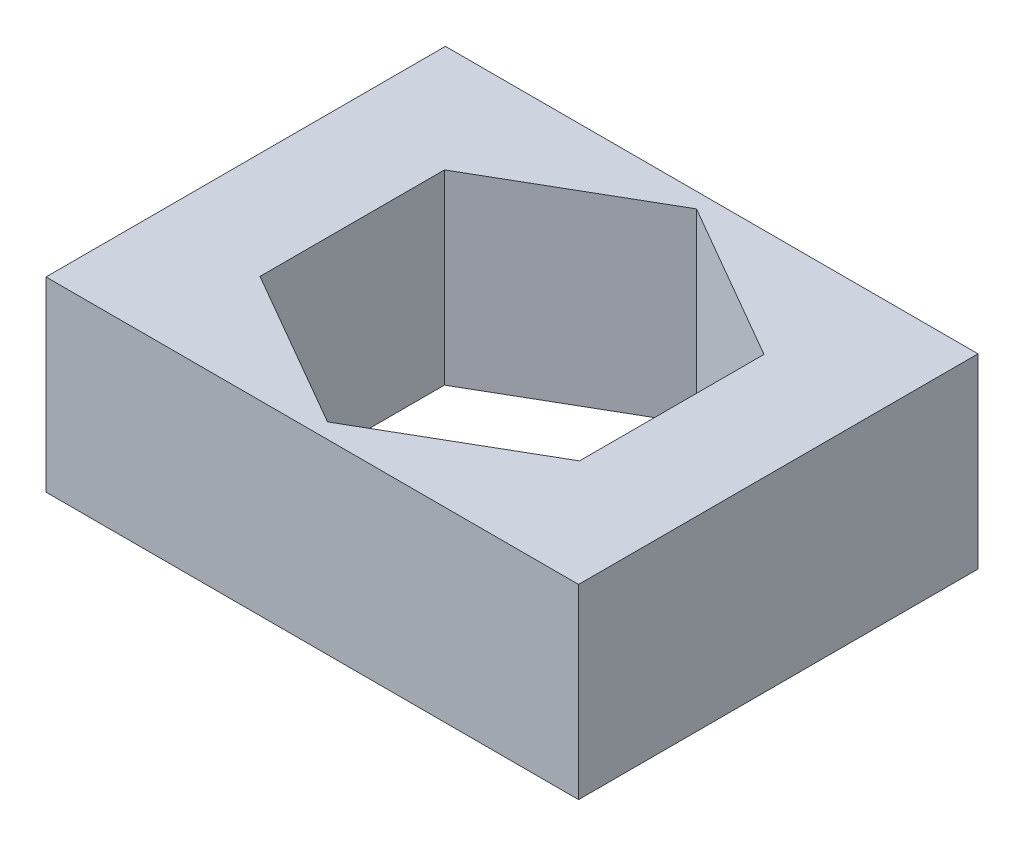
ISO-10303-21;
HEADER;
FILE_DESCRIPTION(('STEP AP214'),'2;1');
FILE_NAME('part.step','',(''),(''),'','','');
FILE_SCHEMA(('AUTOMOTIVE_DESIGN { 1 0 10303 214 1 1 1 1 }'));
ENDSEC;
DATA;
#1=APPLICATION_CONTEXT('core data for automotive mechanical design processes');
#2=APPLICATION_PROTOCOL_DEFINITION('international standard','automotive_design',2000,#1);
#3=PRODUCT_CONTEXT('',#1,'mechanical');
#4=PRODUCT('Part','Part','',(#3));
#5=PRODUCT_RELATED_PRODUCT_CATEGORY('part','',(#4));
#6=PRODUCT_DEFINITION_FORMATION('','',#4);
#7=PRODUCT_DEFINITION_CONTEXT('part definition',#1,'design');
#8=PRODUCT_DEFINITION('design','',#6,#7);
#9=PRODUCT_DEFINITION_SHAPE('','',#8);
#10=(LENGTH_UNIT() NAMED_UNIT(*) SI_UNIT(.MILLI.,.METRE.));
#11=(NAMED_UNIT(*) PLANE_ANGLE_UNIT() SI_UNIT($,.RADIAN.));
#12=(NAMED_UNIT(*) SI_UNIT($,.STERADIAN.) SOLID_ANGLE_UNIT());
#13=UNCERTAINTY_MEASURE_WITH_UNIT(LENGTH_MEASURE(1.E-05),#10,'distance_accuracy_value','');
#14=(GEOMETRIC_REPRESENTATION_CONTEXT(3) GLOBAL_UNCERTAINTY_ASSIGNED_CONTEXT((#13)) GLOBAL_UNIT_ASSIGNED_CONTEXT((#10,
#11,#12)) REPRESENTATION_CONTEXT('',''));
#15=CARTESIAN_POINT('',(0.,0.,0.));
#16=DIRECTION('',(0.,0.,1.));
#17=DIRECTION('',(1.,0.,0.));
#18=AXIS2_PLACEMENT_3D('',#15,#16,#17);
#19=CARTESIAN_POINT('',(10.,7.,7.5));
#20=DIRECTION('',(-1.,0.,0.));
#21=DIRECTION('',(0.,0.,1.));
#22=AXIS2_PLACEMENT_3D('',#19,#20,#21);
#23=PLANE('',#22);
#24=DIRECTION('',(0.,0.,-1.));
#25=VECTOR('',#24,1.);
#26=CARTESIAN_POINT('',(10.,0.,7.5));
#27=LINE('',#26,#25);
#28=CARTESIAN_POINT('',(10.,0.,7.5));
#29=VERTEX_POINT('',#28);
#30=CARTESIAN_POINT('',(10.,0.,-7.5));
#31=VERTEX_POINT('',#30);
#32=EDGE_CURVE('E175',#29,#31,#27,.T.);
#33=ORIENTED_EDGE('',*,*,#32,.T.);
#34=DIRECTION('',(0.,-1.,0.));
#35=VECTOR('',#34,1.);
#36=CARTESIAN_POINT('',(10.,7.,-7.5));
#37=LINE('',#36,#35);
#38=CARTESIAN_POINT('',(10.,7.,-7.5));
#39=VERTEX_POINT('',#38);
#40=EDGE_CURVE('E11',#39,#31,#37,.T.);
#41=ORIENTED_EDGE('',*,*,#40,.F.);
#42=DIRECTION('',(0.,0.,-1.));
#43=VECTOR('',#42,1.);
#44=CARTESIAN_POINT('',(10.,7.,7.5));
#45=LINE('',#44,#43);
#46=CARTESIAN_POINT('',(10.,7.,7.5));
#47=VERTEX_POINT('',#46);
#48=EDGE_CURVE('E187',#47,#39,#45,.T.);
#49=ORIENTED_EDGE('',*,*,#48,.F.);
#50=DIRECTION('',(0.,-1.,0.));
#51=VECTOR('',#50,1.);
#52=CARTESIAN_POINT('',(10.,7.,7.5));
#53=LINE('',#52,#51);
#54=EDGE_CURVE('E201',#47,#29,#53,.T.);
#55=ORIENTED_EDGE('',*,*,#54,.T.);
#56=EDGE_LOOP('',(#33,#41,#49,#55));
#57=FACE_BOUND('',#56,.T.);
#58=ADVANCED_FACE('F39',(#57),#23,.F.);
#59=CARTESIAN_POINT('',(-10.,7.,-7.5));
#60=DIRECTION('',(0.,0.,1.));
#61=DIRECTION('',(1.,0.,0.));
#62=AXIS2_PLACEMENT_3D('',#59,#60,#61);
#63=PLANE('',#62);
#64=DIRECTION('',(-1.,0.,0.));
#65=VECTOR('',#64,1.);
#66=CARTESIAN_POINT('',(-10.,0.,-7.5));
#67=LINE('',#66,#65);
#68=CARTESIAN_POINT('',(-10.,0.,-7.5));
#69=VERTEX_POINT('',#68);
#70=EDGE_CURVE('E205',#31,#69,#67,.T.);
#71=ORIENTED_EDGE('',*,*,#70,.T.);
#72=DIRECTION('',(0.,-1.,0.));
#73=VECTOR('',#72,1.);
#74=CARTESIAN_POINT('',(-10.,7.,-7.5));
#75=LINE('',#74,#73);
#76=CARTESIAN_POINT('',(-10.,7.,-7.5));
#77=VERTEX_POINT('',#76);
#78=EDGE_CURVE('E47',#77,#69,#75,.T.);
#79=ORIENTED_EDGE('',*,*,#78,.F.);
#80=DIRECTION('',(-1.,0.,0.));
#81=VECTOR('',#80,1.);
#82=CARTESIAN_POINT('',(-10.,7.,-7.5));
#83=LINE('',#82,#81);
#84=EDGE_CURVE('E191',#39,#77,#83,.T.);
#85=ORIENTED_EDGE('',*,*,#84,.F.);
#86=ORIENTED_EDGE('',*,*,#40,.T.);
#87=EDGE_LOOP('',(#71,#79,#85,#86));
#88=FACE_BOUND('',#87,.T.);
#89=ADVANCED_FACE('F239',(#88),#63,.F.);
#90=CARTESIAN_POINT('',(-10.,7.,7.5));
#91=DIRECTION('',(1.,0.,0.));
#92=DIRECTION('',(0.,0.,-1.));
#93=AXIS2_PLACEMENT_3D('',#90,#91,#92);
#94=PLANE('',#93);
#95=DIRECTION('',(0.,0.,1.));
#96=VECTOR('',#95,1.);
#97=CARTESIAN_POINT('',(-10.,0.,7.5));
#98=LINE('',#97,#96);
#99=CARTESIAN_POINT('',(-10.,0.,7.5));
#100=VERTEX_POINT('',#99);
#101=EDGE_CURVE('E208',#69,#100,#98,.T.);
#102=ORIENTED_EDGE('',*,*,#101,.T.);
#103=DIRECTION('',(0.,-1.,0.));
#104=VECTOR('',#103,1.);
#105=CARTESIAN_POINT('',(-10.,7.,7.5));
#106=LINE('',#105,#104);
#107=CARTESIAN_POINT('',(-10.,7.,7.5));
#108=VERTEX_POINT('',#107);
#109=EDGE_CURVE('E216',#108,#100,#106,.T.);
#110=ORIENTED_EDGE('',*,*,#109,.F.);
#111=DIRECTION('',(0.,0.,1.));
#112=VECTOR('',#111,1.);
#113=CARTESIAN_POINT('',(-10.,7.,7.5));
#114=LINE('',#113,#112);
#115=EDGE_CURVE('E195',#77,#108,#114,.T.);
#116=ORIENTED_EDGE('',*,*,#115,.F.);
#117=ORIENTED_EDGE('',*,*,#78,.T.);
#118=EDGE_LOOP('',(#102,#110,#116,#117));
#119=FACE_BOUND('',#118,.T.);
#120=ADVANCED_FACE('F225',(#119),#94,.F.);
#121=CARTESIAN_POINT('',(-10.,7.,7.5));
#122=DIRECTION('',(0.,0.,-1.));
#123=DIRECTION('',(-1.,0.,0.));
#124=AXIS2_PLACEMENT_3D('',#121,#122,#123);
#125=PLANE('',#124);
#126=DIRECTION('',(1.,0.,0.));
#127=VECTOR('',#126,1.);
#128=CARTESIAN_POINT('',(-10.,0.,7.5));
#129=LINE('',#128,#127);
#130=EDGE_CURVE('E192',#100,#29,#129,.T.);
#131=ORIENTED_EDGE('',*,*,#130,.T.);
#132=ORIENTED_EDGE('',*,*,#54,.F.);
#133=DIRECTION('',(1.,0.,0.));
#134=VECTOR('',#133,1.);
#135=CARTESIAN_POINT('',(-10.,7.,7.5));
#136=LINE('',#135,#134);
#137=EDGE_CURVE('E198',#108,#47,#136,.T.);
#138=ORIENTED_EDGE('',*,*,#137,.F.);
#139=ORIENTED_EDGE('',*,*,#109,.T.);
#140=EDGE_LOOP('',(#131,#132,#138,#139));
#141=FACE_BOUND('',#140,.T.);
#142=ADVANCED_FACE('F234',(#141),#125,.F.);
#143=CARTESIAN_POINT('',(0.,7.,0.));
#144=DIRECTION('',(0.,-1.,0.));
#145=DIRECTION('',(0.,0.,-1.));
#146=AXIS2_PLACEMENT_3D('',#143,#144,#145);
#147=PLANE('',#146);
#148=DIRECTION('',(0.,0.,1.));
#149=VECTOR('',#148,1.);
#150=CARTESIAN_POINT('',(6.,7.,-3.46410161513776));
#151=LINE('',#150,#149);
#152=CARTESIAN_POINT('',(6.,7.,-3.46410161513776));
#153=VERTEX_POINT('',#152);
#154=CARTESIAN_POINT('',(6.,7.,3.46410161513776));
#155=VERTEX_POINT('',#154);
#156=EDGE_CURVE('E125',#153,#155,#151,.T.);
#157=ORIENTED_EDGE('',*,*,#156,.T.);
#158=DIRECTION('',(-0.866025403784439,0.,0.5));
#159=VECTOR('',#158,1.);
#160=CARTESIAN_POINT('',(6.,7.,3.46410161513776));
#161=LINE('',#160,#159);
#162=CARTESIAN_POINT('',(0.,7.,6.92820323027551));
#163=VERTEX_POINT('',#162);
#164=EDGE_CURVE('E118',#155,#163,#161,.T.);
#165=ORIENTED_EDGE('',*,*,#164,.T.);
#166=DIRECTION('',(-0.866025403784439,0.,-0.5));
#167=VECTOR('',#166,1.);
#168=CARTESIAN_POINT('',(0.,7.,6.92820323027551));
#169=LINE('',#168,#167);
#170=CARTESIAN_POINT('',(-6.,7.,3.46410161513776));
#171=VERTEX_POINT('',#170);
#172=EDGE_CURVE('E128',#163,#171,#169,.T.);
#173=ORIENTED_EDGE('',*,*,#172,.T.);
#174=DIRECTION('',(0.,0.,-1.));
#175=VECTOR('',#174,1.);
#176=CARTESIAN_POINT('',(-6.,7.,3.46410161513776));
#177=LINE('',#176,#175);
#178=CARTESIAN_POINT('',(-6.,7.,-3.46410161513776));
#179=VERTEX_POINT('',#178);
#180=EDGE_CURVE('E54',#171,#179,#177,.T.);
#181=ORIENTED_EDGE('',*,*,#180,.T.);
#182=DIRECTION('',(0.866025403784439,0.,-0.5));
#183=VECTOR('',#182,1.);
#184=CARTESIAN_POINT('',(-6.,7.,-3.46410161513776));
#185=LINE('',#184,#183);
#186=CARTESIAN_POINT('',(0.,7.,-6.92820323027551));
#187=VERTEX_POINT('',#186);
#188=EDGE_CURVE('E147',#179,#187,#185,.T.);
#189=ORIENTED_EDGE('',*,*,#188,.T.);
#190=DIRECTION('',(0.866025403784439,0.,0.5));
#191=VECTOR('',#190,1.);
#192=CARTESIAN_POINT('',(0.,7.,-6.92820323027551));
#193=LINE('',#192,#191);
#194=EDGE_CURVE('E151',#187,#153,#193,.T.);
#195=ORIENTED_EDGE('',*,*,#194,.T.);
#196=EDGE_LOOP('',(#157,#165,#173,#181,#189,#195));
#197=FACE_BOUND('',#196,.T.);
#198=ORIENTED_EDGE('',*,*,#48,.T.);
#199=ORIENTED_EDGE('',*,*,#84,.T.);
#200=ORIENTED_EDGE('',*,*,#115,.T.);
#201=ORIENTED_EDGE('',*,*,#137,.T.);
#202=EDGE_LOOP('',(#198,#199,#200,#201));
#203=FACE_BOUND('',#202,.T.);
#204=ADVANCED_FACE('F133',(#197,#203),#147,.F.);
#205=CARTESIAN_POINT('',(0.,0.,0.));
#206=DIRECTION('',(0.,-1.,0.));
#207=DIRECTION('',(0.,0.,-1.));
#208=AXIS2_PLACEMENT_3D('',#205,#206,#207);
#209=PLANE('',#208);
#210=DIRECTION('',(-0.866025403784439,0.,0.5));
#211=VECTOR('',#210,1.);
#212=CARTESIAN_POINT('',(6.,0.,3.46410161513776));
#213=LINE('',#212,#211);
#214=CARTESIAN_POINT('',(6.,0.,3.46410161513776));
#215=VERTEX_POINT('',#214);
#216=CARTESIAN_POINT('',(0.,0.,6.92820323027551));
#217=VERTEX_POINT('',#216);
#218=EDGE_CURVE('E62',#215,#217,#213,.T.);
#219=ORIENTED_EDGE('',*,*,#218,.F.);
#220=DIRECTION('',(0.,0.,1.));
#221=VECTOR('',#220,1.);
#222=CARTESIAN_POINT('',(6.,0.,-3.46410161513776));
#223=LINE('',#222,#221);
#224=CARTESIAN_POINT('',(6.,0.,-3.46410161513776));
#225=VERTEX_POINT('',#224);
#226=EDGE_CURVE('E138',#225,#215,#223,.T.);
#227=ORIENTED_EDGE('',*,*,#226,.F.);
#228=DIRECTION('',(0.866025403784439,0.,0.5));
#229=VECTOR('',#228,1.);
#230=CARTESIAN_POINT('',(0.,0.,-6.92820323027551));
#231=LINE('',#230,#229);
#232=CARTESIAN_POINT('',(0.,0.,-6.92820323027551));
#233=VERTEX_POINT('',#232);
#234=EDGE_CURVE('E142',#233,#225,#231,.T.);
#235=ORIENTED_EDGE('',*,*,#234,.F.);
#236=DIRECTION('',(0.866025403784439,0.,-0.5));
#237=VECTOR('',#236,1.);
#238=CARTESIAN_POINT('',(-6.,0.,-3.46410161513776));
#239=LINE('',#238,#237);
#240=CARTESIAN_POINT('',(-6.,0.,-3.46410161513776));
#241=VERTEX_POINT('',#240);
#242=EDGE_CURVE('E165',#241,#233,#239,.T.);
#243=ORIENTED_EDGE('',*,*,#242,.F.);
#244=DIRECTION('',(0.,0.,-1.));
#245=VECTOR('',#244,1.);
#246=CARTESIAN_POINT('',(-6.,0.,3.46410161513776));
#247=LINE('',#246,#245);
#248=CARTESIAN_POINT('',(-6.,0.,3.46410161513776));
#249=VERTEX_POINT('',#248);
#250=EDGE_CURVE('E161',#249,#241,#247,.T.);
#251=ORIENTED_EDGE('',*,*,#250,.F.);
#252=DIRECTION('',(-0.866025403784439,0.,-0.5));
#253=VECTOR('',#252,1.);
#254=CARTESIAN_POINT('',(0.,0.,6.92820323027551));
#255=LINE('',#254,#253);
#256=EDGE_CURVE('E158',#217,#249,#255,.T.);
#257=ORIENTED_EDGE('',*,*,#256,.F.);
#258=EDGE_LOOP('',(#219,#227,#235,#243,#251,#257));
#259=FACE_BOUND('',#258,.T.);
#260=ORIENTED_EDGE('',*,*,#32,.F.);
#261=ORIENTED_EDGE('',*,*,#130,.F.);
#262=ORIENTED_EDGE('',*,*,#101,.F.);
#263=ORIENTED_EDGE('',*,*,#70,.F.);
#264=EDGE_LOOP('',(#260,#261,#262,#263));
#265=FACE_BOUND('',#264,.T.);
#266=ADVANCED_FACE('F231',(#259,#265),#209,.T.);
#267=CARTESIAN_POINT('',(6.,7.,3.46410161513776));
#268=DIRECTION('',(0.5,0.,0.866025403784439));
#269=DIRECTION('',(0.866025403784439,0.,-0.5));
#270=AXIS2_PLACEMENT_3D('',#267,#268,#269);
#271=PLANE('',#270);
#272=ORIENTED_EDGE('',*,*,#218,.T.);
#273=DIRECTION('',(0.,-1.,0.));
#274=VECTOR('',#273,1.);
#275=CARTESIAN_POINT('',(0.,7.,6.92820323027551));
#276=LINE('',#275,#274);
#277=EDGE_CURVE('E114',#163,#217,#276,.T.);
#278=ORIENTED_EDGE('',*,*,#277,.F.);
#279=ORIENTED_EDGE('',*,*,#164,.F.);
#280=DIRECTION('',(0.,-1.,0.));
#281=VECTOR('',#280,1.);
#282=CARTESIAN_POINT('',(6.,7.,3.46410161513776));
#283=LINE('',#282,#281);
#284=EDGE_CURVE('E172',#155,#215,#283,.T.);
#285=ORIENTED_EDGE('',*,*,#284,.T.);
#286=EDGE_LOOP('',(#272,#278,#279,#285));
#287=FACE_BOUND('',#286,.T.);
#288=ADVANCED_FACE('F116',(#287),#271,.F.);
#289=CARTESIAN_POINT('',(6.,7.,-3.46410161513776));
#290=DIRECTION('',(1.,0.,0.));
#291=DIRECTION('',(0.,0.,-1.));
#292=AXIS2_PLACEMENT_3D('',#289,#290,#291);
#293=PLANE('',#292);
#294=ORIENTED_EDGE('',*,*,#226,.T.);
#295=ORIENTED_EDGE('',*,*,#284,.F.);
#296=ORIENTED_EDGE('',*,*,#156,.F.);
#297=DIRECTION('',(0.,-1.,0.));
#298=VECTOR('',#297,1.);
#299=CARTESIAN_POINT('',(6.,7.,-3.46410161513776));
#300=LINE('',#299,#298);
#301=EDGE_CURVE('E176',#153,#225,#300,.T.);
#302=ORIENTED_EDGE('',*,*,#301,.T.);
#303=EDGE_LOOP('',(#294,#295,#296,#302));
#304=FACE_BOUND('',#303,.T.);
#305=ADVANCED_FACE('F256',(#304),#293,.F.);
#306=CARTESIAN_POINT('',(0.,7.,-6.92820323027551));
#307=DIRECTION('',(0.5,0.,-0.866025403784439));
#308=DIRECTION('',(-0.866025403784439,0.,-0.5));
#309=AXIS2_PLACEMENT_3D('',#306,#307,#308);
#310=PLANE('',#309);
#311=ORIENTED_EDGE('',*,*,#234,.T.);
#312=ORIENTED_EDGE('',*,*,#301,.F.);
#313=ORIENTED_EDGE('',*,*,#194,.F.);
#314=DIRECTION('',(0.,-1.,0.));
#315=VECTOR('',#314,1.);
#316=CARTESIAN_POINT('',(0.,7.,-6.92820323027551));
#317=LINE('',#316,#315);
#318=EDGE_CURVE('E179',#187,#233,#317,.T.);
#319=ORIENTED_EDGE('',*,*,#318,.T.);
#320=EDGE_LOOP('',(#311,#312,#313,#319));
#321=FACE_BOUND('',#320,.T.);
#322=ADVANCED_FACE('F265',(#321),#310,.F.);
#323=CARTESIAN_POINT('',(-6.,7.,-3.46410161513776));
#324=DIRECTION('',(-0.5,0.,-0.866025403784439));
#325=DIRECTION('',(-0.866025403784439,0.,0.5));
#326=AXIS2_PLACEMENT_3D('',#323,#324,#325);
#327=PLANE('',#326);
#328=ORIENTED_EDGE('',*,*,#242,.T.);
#329=ORIENTED_EDGE('',*,*,#318,.F.);
#330=ORIENTED_EDGE('',*,*,#188,.F.);
#331=DIRECTION('',(0.,-1.,0.));
#332=VECTOR('',#331,1.);
#333=CARTESIAN_POINT('',(-6.,7.,-3.46410161513776));
#334=LINE('',#333,#332);
#335=EDGE_CURVE('E182',#179,#241,#334,.T.);
#336=ORIENTED_EDGE('',*,*,#335,.T.);
#337=EDGE_LOOP('',(#328,#329,#330,#336));
#338=FACE_BOUND('',#337,.T.);
#339=ADVANCED_FACE('F262',(#338),#327,.F.);
#340=CARTESIAN_POINT('',(-6.,7.,3.46410161513776));
#341=DIRECTION('',(-1.,0.,0.));
#342=DIRECTION('',(0.,0.,1.));
#343=AXIS2_PLACEMENT_3D('',#340,#341,#342);
#344=PLANE('',#343);
#345=ORIENTED_EDGE('',*,*,#250,.T.);
#346=ORIENTED_EDGE('',*,*,#335,.F.);
#347=ORIENTED_EDGE('',*,*,#180,.F.);
#348=DIRECTION('',(0.,-1.,0.));
#349=VECTOR('',#348,1.);
#350=CARTESIAN_POINT('',(-6.,7.,3.46410161513776));
#351=LINE('',#350,#349);
#352=EDGE_CURVE('E124',#171,#249,#351,.T.);
#353=ORIENTED_EDGE('',*,*,#352,.T.);
#354=EDGE_LOOP('',(#345,#346,#347,#353));
#355=FACE_BOUND('',#354,.T.);
#356=ADVANCED_FACE('F259',(#355),#344,.F.);
#357=CARTESIAN_POINT('',(0.,7.,6.92820323027551));
#358=DIRECTION('',(-0.5,0.,0.866025403784439));
#359=DIRECTION('',(0.866025403784439,0.,0.5));
#360=AXIS2_PLACEMENT_3D('',#357,#358,#359);
#361=PLANE('',#360);
#362=ORIENTED_EDGE('',*,*,#256,.T.);
#363=ORIENTED_EDGE('',*,*,#352,.F.);
#364=ORIENTED_EDGE('',*,*,#172,.F.);
#365=ORIENTED_EDGE('',*,*,#277,.T.);
#366=EDGE_LOOP('',(#362,#363,#364,#365));
#367=FACE_BOUND('',#366,.T.);
#368=ADVANCED_FACE('F129',(#367),#361,.F.);
#369=CLOSED_SHELL('',(#58,#89,#120,#142,#204,#266,#288,#305,#322,#339,#356,#368));
#370=MANIFOLD_SOLID_BREP('B2',#369);
#371=ADVANCED_BREP_SHAPE_REPRESENTATION('',(#18,#370),#14);
#372=SHAPE_DEFINITION_REPRESENTATION(#9,#371);
ENDSEC;
END-ISO-10303-21;
